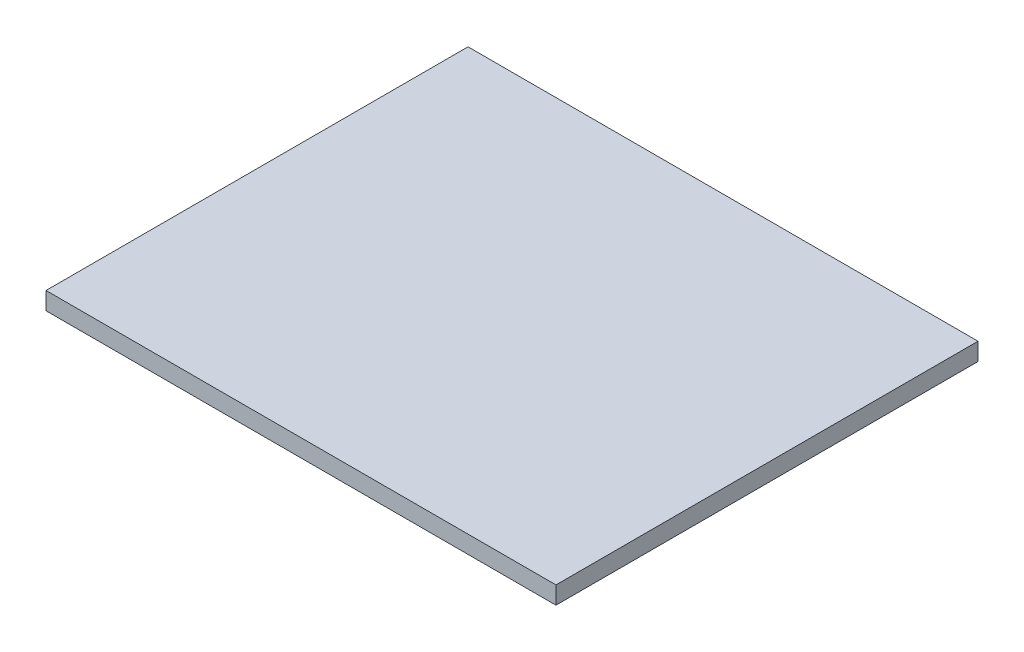
ISO-10303-21;
HEADER;
FILE_DESCRIPTION(('STEP AP214'),'2;1');
FILE_NAME('part.step','',(''),(''),'','','');
FILE_SCHEMA(('AUTOMOTIVE_DESIGN { 1 0 10303 214 1 1 1 1 }'));
ENDSEC;
DATA;
#1=APPLICATION_CONTEXT('core data for automotive mechanical design processes');
#2=APPLICATION_PROTOCOL_DEFINITION('international standard','automotive_design',2000,#1);
#3=PRODUCT_CONTEXT('',#1,'mechanical');
#4=PRODUCT('Part','Part','',(#3));
#5=PRODUCT_RELATED_PRODUCT_CATEGORY('part','',(#4));
#6=PRODUCT_DEFINITION_FORMATION('','',#4);
#7=PRODUCT_DEFINITION_CONTEXT('part definition',#1,'design');
#8=PRODUCT_DEFINITION('design','',#6,#7);
#9=PRODUCT_DEFINITION_SHAPE('','',#8);
#10=(LENGTH_UNIT() NAMED_UNIT(*) SI_UNIT(.MILLI.,.METRE.));
#11=(NAMED_UNIT(*) PLANE_ANGLE_UNIT() SI_UNIT($,.RADIAN.));
#12=(NAMED_UNIT(*) SI_UNIT($,.STERADIAN.) SOLID_ANGLE_UNIT());
#13=UNCERTAINTY_MEASURE_WITH_UNIT(LENGTH_MEASURE(1.E-05),#10,'distance_accuracy_value','');
#14=(GEOMETRIC_REPRESENTATION_CONTEXT(3) GLOBAL_UNCERTAINTY_ASSIGNED_CONTEXT((#13)) GLOBAL_UNIT_ASSIGNED_CONTEXT((#10,
#11,#12)) REPRESENTATION_CONTEXT('',''));
#15=CARTESIAN_POINT('',(0.,0.,0.));
#16=DIRECTION('',(0.,0.,1.));
#17=DIRECTION('',(1.,0.,0.));
#18=AXIS2_PLACEMENT_3D('',#15,#16,#17);
#19=CARTESIAN_POINT('',(0.,25.4,0.));
#20=DIRECTION('',(1.,0.,0.));
#21=DIRECTION('',(0.,0.,-1.));
#22=AXIS2_PLACEMENT_3D('',#19,#20,#21);
#23=PLANE('',#22);
#24=DIRECTION('',(0.,0.,1.));
#25=VECTOR('',#24,1.);
#26=CARTESIAN_POINT('',(0.,0.,0.));
#27=LINE('',#26,#25);
#28=CARTESIAN_POINT('',(0.,0.,-609.6));
#29=VERTEX_POINT('',#28);
#30=CARTESIAN_POINT('',(0.,0.,0.));
#31=VERTEX_POINT('',#30);
#32=EDGE_CURVE('E96',#29,#31,#27,.T.);
#33=ORIENTED_EDGE('',*,*,#32,.T.);
#34=DIRECTION('',(0.,-1.,0.));
#35=VECTOR('',#34,1.);
#36=CARTESIAN_POINT('',(0.,25.4,0.));
#37=LINE('',#36,#35);
#38=CARTESIAN_POINT('',(0.,25.4,0.));
#39=VERTEX_POINT('',#38);
#40=EDGE_CURVE('E11',#39,#31,#37,.T.);
#41=ORIENTED_EDGE('',*,*,#40,.F.);
#42=DIRECTION('',(0.,0.,1.));
#43=VECTOR('',#42,1.);
#44=CARTESIAN_POINT('',(0.,25.4,0.));
#45=LINE('',#44,#43);
#46=CARTESIAN_POINT('',(0.,25.4,-609.6));
#47=VERTEX_POINT('',#46);
#48=EDGE_CURVE('E84',#47,#39,#45,.T.);
#49=ORIENTED_EDGE('',*,*,#48,.F.);
#50=DIRECTION('',(0.,-1.,0.));
#51=VECTOR('',#50,1.);
#52=CARTESIAN_POINT('',(0.,25.4,-609.6));
#53=LINE('',#52,#51);
#54=EDGE_CURVE('E92',#47,#29,#53,.T.);
#55=ORIENTED_EDGE('',*,*,#54,.T.);
#56=EDGE_LOOP('',(#33,#41,#49,#55));
#57=FACE_BOUND('',#56,.T.);
#58=ADVANCED_FACE('F33',(#57),#23,.F.);
#59=CARTESIAN_POINT('',(0.,25.4,0.));
#60=DIRECTION('',(0.,0.,-1.));
#61=DIRECTION('',(-1.,0.,0.));
#62=AXIS2_PLACEMENT_3D('',#59,#60,#61);
#63=PLANE('',#62);
#64=DIRECTION('',(1.,0.,0.));
#65=VECTOR('',#64,1.);
#66=CARTESIAN_POINT('',(0.,0.,0.));
#67=LINE('',#66,#65);
#68=CARTESIAN_POINT('',(736.6,0.,0.));
#69=VERTEX_POINT('',#68);
#70=EDGE_CURVE('E88',#31,#69,#67,.T.);
#71=ORIENTED_EDGE('',*,*,#70,.T.);
#72=DIRECTION('',(0.,-1.,0.));
#73=VECTOR('',#72,1.);
#74=CARTESIAN_POINT('',(736.6,25.4,0.));
#75=LINE('',#74,#73);
#76=CARTESIAN_POINT('',(736.6,25.4,0.));
#77=VERTEX_POINT('',#76);
#78=EDGE_CURVE('E41',#77,#69,#75,.T.);
#79=ORIENTED_EDGE('',*,*,#78,.F.);
#80=DIRECTION('',(1.,0.,0.));
#81=VECTOR('',#80,1.);
#82=CARTESIAN_POINT('',(0.,25.4,0.));
#83=LINE('',#82,#81);
#84=EDGE_CURVE('E79',#39,#77,#83,.T.);
#85=ORIENTED_EDGE('',*,*,#84,.F.);
#86=ORIENTED_EDGE('',*,*,#40,.T.);
#87=EDGE_LOOP('',(#71,#79,#85,#86));
#88=FACE_BOUND('',#87,.T.);
#89=ADVANCED_FACE('F87',(#88),#63,.F.);
#90=CARTESIAN_POINT('',(736.6,25.4,0.));
#91=DIRECTION('',(-1.,0.,0.));
#92=DIRECTION('',(0.,0.,1.));
#93=AXIS2_PLACEMENT_3D('',#90,#91,#92);
#94=PLANE('',#93);
#95=DIRECTION('',(0.,0.,-1.));
#96=VECTOR('',#95,1.);
#97=CARTESIAN_POINT('',(736.6,0.,0.));
#98=LINE('',#97,#96);
#99=CARTESIAN_POINT('',(736.6,0.,-609.6));
#100=VERTEX_POINT('',#99);
#101=EDGE_CURVE('E66',#69,#100,#98,.T.);
#102=ORIENTED_EDGE('',*,*,#101,.T.);
#103=DIRECTION('',(0.,-1.,0.));
#104=VECTOR('',#103,1.);
#105=CARTESIAN_POINT('',(736.6,25.4,-609.6));
#106=LINE('',#105,#104);
#107=CARTESIAN_POINT('',(736.6,25.4,-609.6));
#108=VERTEX_POINT('',#107);
#109=EDGE_CURVE('E89',#108,#100,#106,.T.);
#110=ORIENTED_EDGE('',*,*,#109,.F.);
#111=DIRECTION('',(0.,0.,-1.));
#112=VECTOR('',#111,1.);
#113=CARTESIAN_POINT('',(736.6,25.4,0.));
#114=LINE('',#113,#112);
#115=EDGE_CURVE('E82',#77,#108,#114,.T.);
#116=ORIENTED_EDGE('',*,*,#115,.F.);
#117=ORIENTED_EDGE('',*,*,#78,.T.);
#118=EDGE_LOOP('',(#102,#110,#116,#117));
#119=FACE_BOUND('',#118,.T.);
#120=ADVANCED_FACE('F90',(#119),#94,.F.);
#121=CARTESIAN_POINT('',(0.,25.4,-609.6));
#122=DIRECTION('',(0.,0.,1.));
#123=DIRECTION('',(1.,0.,0.));
#124=AXIS2_PLACEMENT_3D('',#121,#122,#123);
#125=PLANE('',#124);
#126=DIRECTION('',(-1.,0.,0.));
#127=VECTOR('',#126,1.);
#128=CARTESIAN_POINT('',(0.,0.,-609.6));
#129=LINE('',#128,#127);
#130=EDGE_CURVE('E72',#100,#29,#129,.T.);
#131=ORIENTED_EDGE('',*,*,#130,.T.);
#132=ORIENTED_EDGE('',*,*,#54,.F.);
#133=DIRECTION('',(-1.,0.,0.));
#134=VECTOR('',#133,1.);
#135=CARTESIAN_POINT('',(0.,25.4,-609.6));
#136=LINE('',#135,#134);
#137=EDGE_CURVE('E49',#108,#47,#136,.T.);
#138=ORIENTED_EDGE('',*,*,#137,.F.);
#139=ORIENTED_EDGE('',*,*,#109,.T.);
#140=EDGE_LOOP('',(#131,#132,#138,#139));
#141=FACE_BOUND('',#140,.T.);
#142=ADVANCED_FACE('F103',(#141),#125,.F.);
#143=CARTESIAN_POINT('',(0.,25.4,0.));
#144=DIRECTION('',(0.,-1.,0.));
#145=DIRECTION('',(0.,0.,-1.));
#146=AXIS2_PLACEMENT_3D('',#143,#144,#145);
#147=PLANE('',#146);
#148=ORIENTED_EDGE('',*,*,#48,.T.);
#149=ORIENTED_EDGE('',*,*,#84,.T.);
#150=ORIENTED_EDGE('',*,*,#115,.T.);
#151=ORIENTED_EDGE('',*,*,#137,.T.);
#152=EDGE_LOOP('',(#148,#149,#150,#151));
#153=FACE_BOUND('',#152,.T.);
#154=ADVANCED_FACE('F80',(#153),#147,.F.);
#155=CARTESIAN_POINT('',(0.,0.,0.));
#156=DIRECTION('',(0.,-1.,0.));
#157=DIRECTION('',(0.,0.,-1.));
#158=AXIS2_PLACEMENT_3D('',#155,#156,#157);
#159=PLANE('',#158);
#160=ORIENTED_EDGE('',*,*,#32,.F.);
#161=ORIENTED_EDGE('',*,*,#130,.F.);
#162=ORIENTED_EDGE('',*,*,#101,.F.);
#163=ORIENTED_EDGE('',*,*,#70,.F.);
#164=EDGE_LOOP('',(#160,#161,#162,#163));
#165=FACE_BOUND('',#164,.T.);
#166=ADVANCED_FACE('F106',(#165),#159,.T.);
#167=CLOSED_SHELL('',(#58,#89,#120,#142,#154,#166));
#168=MANIFOLD_SOLID_BREP('B2',#167);
#169=ADVANCED_BREP_SHAPE_REPRESENTATION('',(#18,#168),#14);
#170=SHAPE_DEFINITION_REPRESENTATION(#9,#169);
ENDSEC;
END-ISO-10303-21;
